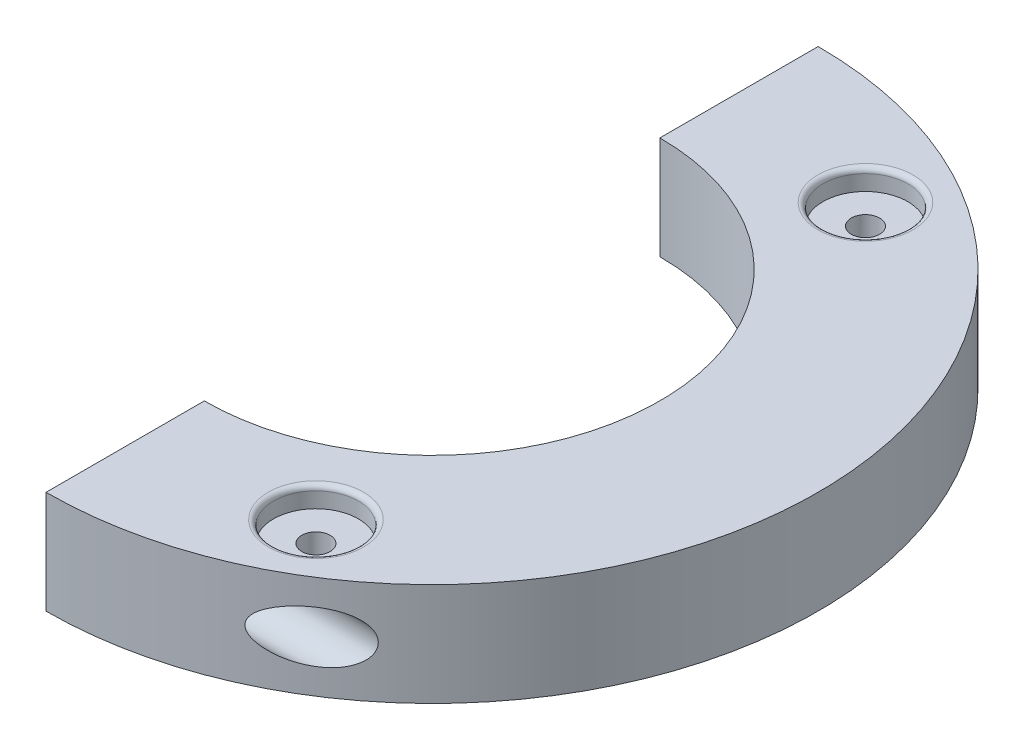
ISO-10303-21;
HEADER;
FILE_DESCRIPTION(('STEP AP214'),'2;1');
FILE_NAME('part.step','',(''),(''),'','','');
FILE_SCHEMA(('AUTOMOTIVE_DESIGN { 1 0 10303 214 1 1 1 1 }'));
ENDSEC;
DATA;
#1=APPLICATION_CONTEXT('core data for automotive mechanical design processes');
#2=APPLICATION_PROTOCOL_DEFINITION('international standard','automotive_design',2000,#1);
#3=PRODUCT_CONTEXT('',#1,'mechanical');
#4=PRODUCT('Part','Part','',(#3));
#5=PRODUCT_RELATED_PRODUCT_CATEGORY('part','',(#4));
#6=PRODUCT_DEFINITION_FORMATION('','',#4);
#7=PRODUCT_DEFINITION_CONTEXT('part definition',#1,'design');
#8=PRODUCT_DEFINITION('design','',#6,#7);
#9=PRODUCT_DEFINITION_SHAPE('','',#8);
#10=(LENGTH_UNIT() NAMED_UNIT(*) SI_UNIT(.MILLI.,.METRE.));
#11=(NAMED_UNIT(*) PLANE_ANGLE_UNIT() SI_UNIT($,.RADIAN.));
#12=(NAMED_UNIT(*) SI_UNIT($,.STERADIAN.) SOLID_ANGLE_UNIT());
#13=UNCERTAINTY_MEASURE_WITH_UNIT(LENGTH_MEASURE(1.E-05),#10,'distance_accuracy_value','');
#14=(GEOMETRIC_REPRESENTATION_CONTEXT(3) GLOBAL_UNCERTAINTY_ASSIGNED_CONTEXT((#13)) GLOBAL_UNIT_ASSIGNED_CONTEXT((#10,
#11,#12)) REPRESENTATION_CONTEXT('',''));
#15=CARTESIAN_POINT('',(0.,0.,0.));
#16=DIRECTION('',(0.,0.,1.));
#17=DIRECTION('',(1.,0.,0.));
#18=AXIS2_PLACEMENT_3D('',#15,#16,#17);
#19=CARTESIAN_POINT('',(30.8149999999999,-4.,-53.373145635235));
#20=DIRECTION('',(0.,1.,0.));
#21=DIRECTION('',(0.,0.,1.));
#22=AXIS2_PLACEMENT_3D('',#19,#20,#21);
#23=CYLINDRICAL_SURFACE('',#22,2.75);
#24=CARTESIAN_POINT('',(30.8149999999999,16.,-53.373145635235));
#25=DIRECTION('',(0.,1.,0.));
#26=DIRECTION('',(0.,0.,1.));
#27=AXIS2_PLACEMENT_3D('',#24,#25,#26);
#28=CIRCLE('',#27,2.75);
#29=CARTESIAN_POINT('',(30.8149999999999,16.,-50.623145635235));
#30=VERTEX_POINT('',#29);
#31=EDGE_CURVE('E153',#30,#30,#28,.T.);
#32=ORIENTED_EDGE('',*,*,#31,.T.);
#33=EDGE_LOOP('',(#32));
#34=FACE_BOUND('',#33,.T.);
#35=CARTESIAN_POINT('',(30.8149999999999,5.,-53.373145635235));
#36=DIRECTION('',(0.,-1.,0.));
#37=DIRECTION('',(0.,0.,-1.));
#38=AXIS2_PLACEMENT_3D('',#35,#36,#37);
#39=CIRCLE('',#38,2.75);
#40=CARTESIAN_POINT('',(30.8149999999999,5.,-56.123145635235));
#41=VERTEX_POINT('',#40);
#42=EDGE_CURVE('E116',#41,#41,#39,.F.);
#43=ORIENTED_EDGE('',*,*,#42,.F.);
#44=EDGE_LOOP('',(#43));
#45=FACE_BOUND('',#44,.T.);
#46=ADVANCED_FACE('F32',(#34,#45),#23,.F.);
#47=CARTESIAN_POINT('',(30.8149999999999,-4.,53.373145635235));
#48=DIRECTION('',(0.,1.,0.));
#49=DIRECTION('',(0.,0.,1.));
#50=AXIS2_PLACEMENT_3D('',#47,#48,#49);
#51=CYLINDRICAL_SURFACE('',#50,2.75);
#52=CARTESIAN_POINT('',(30.8149999999999,16.,53.373145635235));
#53=DIRECTION('',(0.,1.,0.));
#54=DIRECTION('',(0.,0.,1.));
#55=AXIS2_PLACEMENT_3D('',#52,#53,#54);
#56=CIRCLE('',#55,2.75);
#57=CARTESIAN_POINT('',(30.8149999999999,16.,56.123145635235));
#58=VERTEX_POINT('',#57);
#59=EDGE_CURVE('E114',#58,#58,#56,.T.);
#60=ORIENTED_EDGE('',*,*,#59,.T.);
#61=EDGE_LOOP('',(#60));
#62=FACE_BOUND('',#61,.T.);
#63=CARTESIAN_POINT('',(30.8149999999999,5.,53.373145635235));
#64=DIRECTION('',(0.,-1.,0.));
#65=DIRECTION('',(0.,0.,-1.));
#66=AXIS2_PLACEMENT_3D('',#63,#64,#65);
#67=CIRCLE('',#66,2.75);
#68=CARTESIAN_POINT('',(30.8149999999999,5.,50.623145635235));
#69=VERTEX_POINT('',#68);
#70=EDGE_CURVE('E111',#69,#69,#67,.F.);
#71=ORIENTED_EDGE('',*,*,#70,.F.);
#72=EDGE_LOOP('',(#71));
#73=FACE_BOUND('',#72,.T.);
#74=ADVANCED_FACE('F196',(#62,#73),#51,.F.);
#75=CARTESIAN_POINT('',(0.,20.,0.));
#76=DIRECTION('',(0.,-1.,0.));
#77=DIRECTION('',(0.,0.,-1.));
#78=AXIS2_PLACEMENT_3D('',#75,#76,#77);
#79=CYLINDRICAL_SURFACE('',#78,75.);
#80=CARTESIAN_POINT('',(31.6385840391127,10.,68.));
#81=CARTESIAN_POINT('',(31.6386043049395,10.130910240401,67.9999910185497));
#82=CARTESIAN_POINT('',(31.6497773414487,10.2619510558737,67.994795495824));
#83=CARTESIAN_POINT('',(31.6931025507327,10.519668822244,67.9746112354656));
#84=CARTESIAN_POINT('',(31.7252771460586,10.6463409565113,67.9596120307983));
#85=CARTESIAN_POINT('',(31.8178267223558,10.9242082664239,67.9163390108497));
#86=CARTESIAN_POINT('',(31.8833395122352,11.0732852500896,67.8856369495269));
#87=CARTESIAN_POINT('',(32.0347994083835,11.3580357433039,67.8142949470539));
#88=CARTESIAN_POINT('',(32.1207911429329,11.4936790507488,67.7736332960969));
#89=CARTESIAN_POINT('',(32.2920439725618,11.7310450800738,67.6921813405926));
#90=CARTESIAN_POINT('',(32.3751857787517,11.834710127069,67.6524696290556));
#91=CARTESIAN_POINT('',(32.5490861624433,12.0337483365845,67.5689743542185));
#92=CARTESIAN_POINT('',(32.6398502360732,12.1291154130981,67.5251878502367));
#93=CARTESIAN_POINT('',(32.8272551580185,12.3124975792838,67.4342805518963));
#94=CARTESIAN_POINT('',(32.923906236838,12.4004992007082,67.3871539283699));
#95=CARTESIAN_POINT('',(33.1216517788546,12.5698002260467,67.29017997161));
#96=CARTESIAN_POINT('',(33.2227479762706,12.6510969779066,67.2403315746364));
#97=CARTESIAN_POINT('',(33.4304405971,12.8092149661935,67.1373170810409));
#98=CARTESIAN_POINT('',(33.5371066321114,12.8859139312831,67.0841045283348));
#99=CARTESIAN_POINT('',(33.7532795122364,13.0336459938454,66.975598337797));
#100=CARTESIAN_POINT('',(33.862786943052,13.1046779106642,66.9203042698227));
#101=CARTESIAN_POINT('',(34.1948334160541,13.3101455609536,66.7515911470798));
#102=CARTESIAN_POINT('',(34.4207684896768,13.4368580978289,66.635404610631));
#103=CARTESIAN_POINT('',(34.8789150839471,13.6729110584102,66.3967488614365));
#104=CARTESIAN_POINT('',(35.1111390256008,13.782213644162,66.2742667095864));
#105=CARTESIAN_POINT('',(35.579585876079,13.9851739935609,66.0239623522249));
#106=CARTESIAN_POINT('',(35.8158099405935,14.0788271479136,65.8961385872342));
#107=CARTESIAN_POINT('',(36.2571270235109,14.2394761828398,65.6542062347242));
#108=CARTESIAN_POINT('',(36.4618804055682,14.3083689684906,65.5407256601142));
#109=CARTESIAN_POINT('',(36.8726841873701,14.4360961201177,65.3104938067467));
#110=CARTESIAN_POINT('',(37.0787346194584,14.4949302342274,65.1937424461748));
#111=CARTESIAN_POINT('',(37.4917638733236,14.6029013755365,64.9570960242608));
#112=CARTESIAN_POINT('',(37.6987432323428,14.6520317631716,64.8371988735894));
#113=CARTESIAN_POINT('',(38.1130589321957,14.740693310428,64.5945230981419));
#114=CARTESIAN_POINT('',(38.3203952852192,14.7802241354458,64.4717443730888));
#115=CARTESIAN_POINT('',(38.9420979478633,14.8844205027191,64.0995009801456));
#116=CARTESIAN_POINT('',(39.3565019543609,14.9347793411688,63.8459321188772));
#117=CARTESIAN_POINT('',(40.1821580307052,14.9958932141049,63.3295433783368));
#118=CARTESIAN_POINT('',(40.5934119289466,15.0066732865724,63.0667294538867));
#119=CARTESIAN_POINT('',(41.2716424289488,14.9889515230388,62.6239224243071));
#120=CARTESIAN_POINT('',(41.5403243878327,14.9725138182165,62.4460154508291));
#121=CARTESIAN_POINT('',(42.0740577199832,14.9193959061121,62.0876551154816));
#122=CARTESIAN_POINT('',(42.3391088582697,14.8827143949717,61.9072015903239));
#123=CARTESIAN_POINT('',(42.8637106567067,14.7873121871805,61.5451355567626));
#124=CARTESIAN_POINT('',(43.1232706443285,14.7286326769032,61.363525833862));
#125=CARTESIAN_POINT('',(43.6355876054964,14.5868425244106,61.0002781088228));
#126=CARTESIAN_POINT('',(43.8883476252455,14.5037430275374,60.8186401572835));
#127=CARTESIAN_POINT('',(44.292700512748,14.3459933279501,60.5243265465805));
#128=CARTESIAN_POINT('',(44.4470862874661,14.2796154886884,60.4110285808003));
#129=CARTESIAN_POINT('',(44.7513799759435,14.1351017303911,60.1859598404483));
#130=CARTESIAN_POINT('',(44.9012890405963,14.0569688651297,60.0741886774387));
#131=CARTESIAN_POINT('',(45.1955515749204,13.8879928905577,59.8531197687008));
#132=CARTESIAN_POINT('',(45.3399084478573,13.7971577308035,59.7438205252787));
#133=CARTESIAN_POINT('',(45.6217689404706,13.6017087347423,59.5288638860448));
#134=CARTESIAN_POINT('',(45.7592748954545,13.4970996385383,59.4232052530801));
#135=CARTESIAN_POINT('',(46.0805742278849,13.226880548985,59.1746310122888));
#136=CARTESIAN_POINT('',(46.2602107526337,13.0538524169725,59.0342160796604));
#137=CARTESIAN_POINT('',(46.5957992649364,12.6753816048502,58.7696947378267));
#138=CARTESIAN_POINT('',(46.7517902127327,12.4699934081908,58.64556154808));
#139=CARTESIAN_POINT('',(46.9961554696421,12.0809831685341,58.4498037077826));
#140=CARTESIAN_POINT('',(47.091695186325,11.904671951153,58.372800388076));
#141=CARTESIAN_POINT('',(47.2173190967098,11.6271976426384,58.2711565981192));
#142=CARTESIAN_POINT('',(47.2562542613524,11.5325109146366,58.2395788670354));
#143=CARTESIAN_POINT('',(47.3275890641949,11.3391879063436,58.1816244499434));
#144=CARTESIAN_POINT('',(47.3599917801059,11.2405535123404,58.1552453147905));
#145=CARTESIAN_POINT('',(47.4179528012435,11.0388162386357,58.1079957426459));
#146=CARTESIAN_POINT('',(47.4434357273605,10.9356773332701,58.0871860072642));
#147=CARTESIAN_POINT('',(47.4865271584831,10.7267413587895,58.0519639229023));
#148=CARTESIAN_POINT('',(47.5041398733758,10.6209457428534,58.0375481537299));
#149=CARTESIAN_POINT('',(47.5310720971355,10.4076554442149,58.015493537204));
#150=CARTESIAN_POINT('',(47.5403959386228,10.3001616790825,58.0078511493891));
#151=CARTESIAN_POINT('',(47.550522692893,10.0845127901001,57.9995503120097));
#152=CARTESIAN_POINT('',(47.5513268653733,9.97635776638832,57.99889082997));
#153=CARTESIAN_POINT('',(47.544910365453,9.77650245655008,58.0041507947662));
#154=CARTESIAN_POINT('',(47.5388601367066,9.68473665886655,58.009110692906));
#155=CARTESIAN_POINT('',(47.5206889250464,9.50220605199002,58.0239972210651));
#156=CARTESIAN_POINT('',(47.5085661052358,9.41144155417558,58.0339253539241));
#157=CARTESIAN_POINT('',(47.4633866845711,9.14167246190047,58.0708920680147));
#158=CARTESIAN_POINT('',(47.421513122503,8.96502242631506,58.1051179396722));
#159=CARTESIAN_POINT('',(47.3166866286472,8.62143224884714,58.190511844715));
#160=CARTESIAN_POINT('',(47.253609742257,8.45455614316863,58.2417794841566));
#161=CARTESIAN_POINT('',(47.1098030764085,8.13386104566194,58.35816185913));
#162=CARTESIAN_POINT('',(47.0290661728798,7.9800473580908,58.4232821825575));
#163=CARTESIAN_POINT('',(46.8015788538567,7.60041194360194,58.6058344367101));
#164=CARTESIAN_POINT('',(46.6438409479835,7.38510526546128,58.7315826642195));
#165=CARTESIAN_POINT('',(46.3880807885799,7.08829177846749,58.9335049569239));
#166=CARTESIAN_POINT('',(46.2994614586482,6.99356751427233,59.0031640411287));
#167=CARTESIAN_POINT('',(46.1167611813796,6.81244402617429,59.1460712207552));
#168=CARTESIAN_POINT('',(46.0226813052409,6.72604317824874,59.2193186118202));
#169=CARTESIAN_POINT('',(45.7776325808656,6.51645994795507,59.4091211183468));
#170=CARTESIAN_POINT('',(45.6234875454716,6.39874909997588,59.5276152823467));
#171=CARTESIAN_POINT('',(45.3066875712722,6.18061722855543,59.7690873263483));
#172=CARTESIAN_POINT('',(45.1440280189902,6.08020570764383,59.8920676259317));
#173=CARTESIAN_POINT('',(44.8119315085458,5.89513712783683,60.1409501045938));
#174=CARTESIAN_POINT('',(44.6424892863363,5.81049260548682,60.2668545199792));
#175=CARTESIAN_POINT('',(44.2982820710605,5.65567182056717,60.5203103213169));
#176=CARTESIAN_POINT('',(44.1235153073353,5.58550043261824,60.6478622468383));
#177=CARTESIAN_POINT('',(43.658996029399,5.41865419162277,60.9837503928164));
#178=CARTESIAN_POINT('',(43.3657347651916,5.33287804153372,61.1926841180324));
#179=CARTESIAN_POINT('',(42.7712516511226,5.19214981547569,61.6096756777762));
#180=CARTESIAN_POINT('',(42.4700249866923,5.13721684975711,61.8177328901721));
#181=CARTESIAN_POINT('',(41.8610235980899,5.05485349921706,62.2317501643527));
#182=CARTESIAN_POINT('',(41.5532306238292,5.02751399412685,62.4377010991448));
#183=CARTESIAN_POINT('',(40.9338567171218,4.99820913891234,62.8454997779355));
#184=CARTESIAN_POINT('',(40.6222764131166,4.99623963508988,63.0473481882158));
#185=CARTESIAN_POINT('',(40.1020295501006,5.01262304217613,63.378922596636));
#186=CARTESIAN_POINT('',(39.8940199065808,5.0243593242616,63.5100581865908));
#187=CARTESIAN_POINT('',(39.4773087583801,5.0578958468384,63.7699174025026));
#188=CARTESIAN_POINT('',(39.2686072782734,5.07969573359266,63.898641113072));
#189=CARTESIAN_POINT('',(38.8507295742256,5.13314826838208,64.1535717134416));
#190=CARTESIAN_POINT('',(38.6415531190296,5.16480786761748,64.2797767605526));
#191=CARTESIAN_POINT('',(38.2232614459783,5.23786920344642,64.5293854985368));
#192=CARTESIAN_POINT('',(38.0141462238856,5.2792698467558,64.6527895020815));
#193=CARTESIAN_POINT('',(37.5973267540532,5.37163142240865,64.8960628872289));
#194=CARTESIAN_POINT('',(37.389620480758,5.42254674814941,65.0159460978921));
#195=CARTESIAN_POINT('',(36.9751026330399,5.53423946437905,65.252576409314));
#196=CARTESIAN_POINT('',(36.7682909547953,5.59501567712685,65.3693238826531));
#197=CARTESIAN_POINT('',(36.3562431765671,5.72673913326962,65.5993842430308));
#198=CARTESIAN_POINT('',(36.1510058842703,5.797677666444,65.7126999717107));
#199=CARTESIAN_POINT('',(35.742621500715,5.95033119124091,65.9357194697817));
#200=CARTESIAN_POINT('',(35.5394739605264,6.03204381390883,66.0454240265726));
#201=CARTESIAN_POINT('',(35.209938016576,6.17508763821634,66.2214564946812));
#202=CARTESIAN_POINT('',(35.0826630679585,6.23293557652394,66.2889675144256));
#203=CARTESIAN_POINT('',(34.82960114638,6.3536204217156,66.4222803601497));
#204=CARTESIAN_POINT('',(34.7038140294241,6.41645684119103,66.4880823522814));
#205=CARTESIAN_POINT('',(34.453598010358,6.54775215057505,66.6180871525063));
#206=CARTESIAN_POINT('',(34.3291763053041,6.61623198339816,66.6822827348579));
#207=CARTESIAN_POINT('',(34.0826844067731,6.75907259688058,66.808605770358));
#208=CARTESIAN_POINT('',(33.9606140884361,6.83343306419852,66.8707333334476));
#209=CARTESIAN_POINT('',(33.6879822226047,7.00887225361027,67.0085729290475));
#210=CARTESIAN_POINT('',(33.5382923131001,7.11186157460865,67.0836024374376));
#211=CARTESIAN_POINT('',(33.2452875246971,7.32973979952337,67.2292914486518));
#212=CARTESIAN_POINT('',(33.1019778786707,7.44463822290437,67.2999473823061));
#213=CARTESIAN_POINT('',(32.8254511422169,7.68747902759857,67.4352525611696));
#214=CARTESIAN_POINT('',(32.6921773294313,7.81533671528237,67.4999361204446));
#215=CARTESIAN_POINT('',(32.4391852549822,8.08680499078399,67.6218815416477));
#216=CARTESIAN_POINT('',(32.319438199006,8.23038078477249,67.6791592075593));
#217=CARTESIAN_POINT('',(32.1261223096233,8.49941259021319,67.7710919083871));
#218=CARTESIAN_POINT('',(32.0483426713876,8.62106394364808,67.8078881254493));
#219=CARTESIAN_POINT('',(31.9088475730992,8.87534658408008,67.8736427328776));
#220=CARTESIAN_POINT('',(31.8471232060211,9.00797172905391,67.9026054694011));
#221=CARTESIAN_POINT('',(31.7459859072922,9.28112619033707,67.9499486893775));
#222=CARTESIAN_POINT('',(31.7062286062616,9.42149317938703,67.9684925879864));
#223=CARTESIAN_POINT('',(31.6659256886927,9.63626586211923,67.9872734469024));
#224=CARTESIAN_POINT('',(31.6557136747872,9.70854438952604,67.9920278496974));
#225=CARTESIAN_POINT('',(31.6420376160864,9.85386844322271,67.9983934362483));
#226=CARTESIAN_POINT('',(31.6385727248656,9.92691387214883,68.0000050142711));
#227=CARTESIAN_POINT('',(31.6385840391127,10.,68.));
#228=B_SPLINE_CURVE_WITH_KNOTS('',3,(#80,#81,#82,#83,#84,#85,#86,#87,#88,#89,#90,#91,#92,#93,
#94,#95,#96,#97,#98,#99,#100,#101,#102,#103,#104,#105,#106,#107,#108,#109,#110,#111,#112,#113,
#114,#115,#116,#117,#118,#119,#120,#121,#122,#123,#124,#125,#126,#127,#128,#129,#130,#131,#132,
#133,#134,#135,#136,#137,#138,#139,#140,#141,#142,#143,#144,#145,#146,#147,#148,#149,#150,#151,
#152,#153,#154,#155,#156,#157,#158,#159,#160,#161,#162,#163,#164,#165,#166,#167,#168,#169,#170,
#171,#172,#173,#174,#175,#176,#177,#178,#179,#180,#181,#182,#183,#184,#185,#186,#187,#188,#189,
#190,#191,#192,#193,#194,#195,#196,#197,#198,#199,#200,#201,#202,#203,#204,#205,#206,#207,#208,
#209,#210,#211,#212,#213,#214,#215,#216,#217,#218,#219,#220,#221,#222,#223,#224,#225,#226,#227),
.UNSPECIFIED.,.T.,.F.,(4,2,2,2,2,2,2,2,2,2,2,2,2,2,2,2,2,2,2,2,2,2,2,2,2,2,2,2,2,2,2,2,2,2,2,2,
2,2,2,2,2,2,2,2,2,2,2,2,2,2,2,2,2,2,2,2,2,2,2,2,2,2,2,2,2,2,2,2,2,2,2,2,2,4),(0.,
0.392417073033789,0.785253801385829,1.27957052302446,1.77497449280437,2.19047283332852,
2.60627338960528,3.02281837077644,3.43952733039178,3.86458353273259,4.28972805987059,
5.14053053489032,5.99315759009596,6.84603533226347,7.57787509030568,8.30973317074543,
9.04209028750928,9.77447292772995,11.2380225319928,12.7006461183171,13.6680614027211,
14.6355390034568,15.601214190905,16.5664493245216,17.1741422800083,17.78167763798,
18.3888344659034,18.9957828929539,19.8517621890389,20.7063154089797,21.3481238930543,
21.6692019117711,21.9901283017857,22.3144218768566,22.6385417744417,22.9624921537487,
23.2863946338805,23.5623436901235,23.8383762685974,24.3899379857357,24.9447818912269,
25.4998500355104,26.3796374792132,26.8210949376384,27.2624660859275,27.9432594415913,
28.624425573287,29.3061310184947,29.9880656917626,31.0967957446329,32.2062120039923,
33.3192703449708,34.4321464483875,35.1704725131323,35.9087726275919,36.6475944341911,
37.3863333587904,38.1216181282806,38.8568151431437,39.5913857426179,40.3257950967675,
40.7914671182698,41.2570936963057,41.7245335891587,42.1919485918911,42.7812566267783,
43.37103940821,43.9571898227963,44.5420680046284,44.9879263269214,45.433536769099,
45.8719475583687,46.0910583238718,46.3101416001906),.UNSPECIFIED.);
#229=CARTESIAN_POINT('',(31.6385840391127,10.,68.));
#230=VERTEX_POINT('',#229);
#231=EDGE_CURVE('E150',#230,#230,#228,.T.);
#232=ORIENTED_EDGE('',*,*,#231,.T.);
#233=EDGE_LOOP('',(#232));
#234=FACE_BOUND('',#233,.T.);
#235=CARTESIAN_POINT('',(47.5499737118749,10.,-58.));
#236=CARTESIAN_POINT('',(47.5499723727416,10.1037608748383,-58.0000011799093));
#237=CARTESIAN_POINT('',(47.5460233464358,10.2075660669426,-58.0032393125726));
#238=CARTESIAN_POINT('',(47.5303158600883,10.4142364656808,-58.01611132814));
#239=CARTESIAN_POINT('',(47.5185512475015,10.5171008669845,-58.0257502498375));
#240=CARTESIAN_POINT('',(47.4874437015999,10.7211645320364,-58.0512109600654));
#241=CARTESIAN_POINT('',(47.4680823081401,10.8223591091708,-58.0670478092908));
#242=CARTESIAN_POINT('',(47.4222135652454,11.0220380049845,-58.1045138960904));
#243=CARTESIAN_POINT('',(47.3957024609909,11.120520869515,-58.1261461772168));
#244=CARTESIAN_POINT('',(47.3067764586632,11.4090117897044,-58.1985799532132));
#245=CARTESIAN_POINT('',(47.2346303889152,11.5941740672888,-58.2571971699242));
#246=CARTESIAN_POINT('',(47.0690377978075,11.9477304624791,-58.3910697125667));
#247=CARTESIAN_POINT('',(46.9755924881431,12.1161255331742,-58.466324092017));
#248=CARTESIAN_POINT('',(46.7233475010711,12.5111510546761,-58.6682660529811));
#249=CARTESIAN_POINT('',(46.554549717121,12.7276165569583,-58.8024380220703));
#250=CARTESIAN_POINT('',(46.282181869623,13.0246467290276,-59.0167202373229));
#251=CARTESIAN_POINT('',(46.1880275579233,13.1191773190145,-59.0904497075076));
#252=CARTESIAN_POINT('',(45.9942710016582,13.2994898456921,-59.2413880720748));
#253=CARTESIAN_POINT('',(45.8946697841603,13.3852734230393,-59.3185963100213));
#254=CARTESIAN_POINT('',(45.634054505643,13.5940844190029,-59.519519401562));
#255=CARTESIAN_POINT('',(45.4697768564993,13.7111927500521,-59.6451510245068));
#256=CARTESIAN_POINT('',(45.1326667627059,13.9270821636187,-59.9006444277401));
#257=CARTESIAN_POINT('',(44.9598296063696,14.0258530067453,-60.0305085240925));
#258=CARTESIAN_POINT('',(44.6072906900314,14.2068076757718,-60.2929345860248));
#259=CARTESIAN_POINT('',(44.4275802514812,14.288969649091,-60.4254998565269));
#260=CARTESIAN_POINT('',(44.062947161912,14.4380170515863,-60.6919082980819));
#261=CARTESIAN_POINT('',(43.8780249007008,14.5049036198668,-60.8257513730716));
#262=CARTESIAN_POINT('',(43.3875464734487,14.6620300960876,-61.1772829354778));
#263=CARTESIAN_POINT('',(43.0785530536856,14.7408891398549,-61.3953010554046));
#264=CARTESIAN_POINT('',(42.4528433705354,14.8663433231199,-61.8296161734582));
#265=CARTESIAN_POINT('',(42.1361223760904,14.9129181566628,-62.0459120039287));
#266=CARTESIAN_POINT('',(41.4966620593214,14.9771518487592,-62.4754009046238));
#267=CARTESIAN_POINT('',(41.1739103515749,14.9947425525875,-62.6885854966473));
#268=CARTESIAN_POINT('',(40.5250133203557,15.0032289925226,-63.11000698686));
#269=CARTESIAN_POINT('',(40.1988687649609,14.9941306449048,-63.3182449712684));
#270=CARTESIAN_POINT('',(39.5254381890096,14.9496253604353,-63.7409356903702));
#271=CARTESIAN_POINT('',(39.1780327849019,14.9127086652467,-63.9550380195791));
#272=CARTESIAN_POINT('',(38.4825875310263,14.8118353875116,-64.375893762904));
#273=CARTESIAN_POINT('',(38.1345475415947,14.747871884382,-64.5826452814479));
#274=CARTESIAN_POINT('',(37.4411619731373,14.5932793059835,-64.9870739217281));
#275=CARTESIAN_POINT('',(37.0958112332019,14.5027651055138,-65.1847859802417));
#276=CARTESIAN_POINT('',(36.4086234098686,14.2939206651559,-65.5710861171299));
#277=CARTESIAN_POINT('',(36.0667844805571,14.1756059107681,-65.7596792047026));
#278=CARTESIAN_POINT('',(35.4584683331904,13.9356194415366,-66.0892660574068));
#279=CARTESIAN_POINT('',(35.1908184530616,13.8195363035611,-66.2321329612748));
#280=CARTESIAN_POINT('',(34.7936396817447,13.6287021068274,-66.4411409700276));
#281=CARTESIAN_POINT('',(34.6616439171905,13.5621215504521,-66.5100910237523));
#282=CARTESIAN_POINT('',(34.3997644123846,13.4229755174741,-66.6459147722235));
#283=CARTESIAN_POINT('',(34.2698804789705,13.3504105919706,-66.7127886573849));
#284=CARTESIAN_POINT('',(33.9665136572548,13.1714494989401,-66.8678880552954));
#285=CARTESIAN_POINT('',(33.7941542752265,13.0622733992092,-66.9551407219254));
#286=CARTESIAN_POINT('',(33.4562030754627,12.8298427586132,-67.1246468532476));
#287=CARTESIAN_POINT('',(33.2906183912359,12.706573871563,-67.2068950906933));
#288=CARTESIAN_POINT('',(32.9708656125867,12.4445454389353,-67.3643341515776));
#289=CARTESIAN_POINT('',(32.8166197149281,12.3059119176713,-67.4395742531998));
#290=CARTESIAN_POINT('',(32.5235991855315,12.0094719141358,-67.5813715107662));
#291=CARTESIAN_POINT('',(32.3847839826824,11.8517181049149,-67.6479515187097));
#292=CARTESIAN_POINT('',(32.1750043286016,11.5720111974751,-67.7478977010577));
#293=CARTESIAN_POINT('',(32.0971692876484,11.4565238188721,-67.7847909267088));
#294=CARTESIAN_POINT('',(31.9554883821782,11.2151960533089,-67.8516976945894));
#295=CARTESIAN_POINT('',(31.8916435592175,11.0893548964799,-67.8817107246036));
#296=CARTESIAN_POINT('',(31.7820433225614,10.8262597658295,-67.9330955388135));
#297=CARTESIAN_POINT('',(31.7365172552275,10.688885645803,-67.9543578368153));
#298=CARTESIAN_POINT('',(31.6699652639198,10.4071065863445,-67.9854007854103));
#299=CARTESIAN_POINT('',(31.6488925033436,10.2627156413641,-67.9952033855864));
#300=CARTESIAN_POINT('',(31.6349206722999,9.9863280591066,-68.0017046431936));
#301=CARTESIAN_POINT('',(31.6394897319517,9.85448599675647,-67.9995808925595));
#302=CARTESIAN_POINT('',(31.6703879030291,9.59393293688061,-67.9851954385008));
#303=CARTESIAN_POINT('',(31.6967346283386,9.465224560672,-67.9729255288094));
#304=CARTESIAN_POINT('',(31.7747084560193,9.19182164102291,-67.9365147299216));
#305=CARTESIAN_POINT('',(31.8300438699538,9.04844188629853,-67.9106291932069));
#306=CARTESIAN_POINT('',(31.9606659350658,8.77332042123505,-67.8492520029106));
#307=CARTESIAN_POINT('',(32.0359916866953,8.64160220125269,-67.8137415203119));
#308=CARTESIAN_POINT('',(32.185529432116,8.41362685161034,-67.742875823893));
#309=CARTESIAN_POINT('',(32.2573089638723,8.31534795957988,-67.7087365756703));
#310=CARTESIAN_POINT('',(32.4081970778022,8.12602278000345,-67.6366450536326));
#311=CARTESIAN_POINT('',(32.4873105534921,8.03498139797248,-67.59869023246));
#312=CARTESIAN_POINT('',(32.6512866093211,7.85940608311939,-67.5196399810683));
#313=CARTESIAN_POINT('',(32.7361594746035,7.77488440044155,-67.4785389145732));
#314=CARTESIAN_POINT('',(32.9103186550683,7.61186061607173,-67.3937707312348));
#315=CARTESIAN_POINT('',(32.9996067085245,7.53336091678991,-67.3501026024325));
#316=CARTESIAN_POINT('',(33.273006193034,7.3057097268692,-67.2156842465877));
#317=CARTESIAN_POINT('',(33.4623369936708,7.16473169644005,-67.1216719183058));
#318=CARTESIAN_POINT('',(33.8499663594477,6.90075589989915,-66.9270275070829));
#319=CARTESIAN_POINT('',(34.0482734867151,6.77777579546154,-66.8263890603449));
#320=CARTESIAN_POINT('',(34.4512936013241,6.54700789075351,-66.6195149942914));
#321=CARTESIAN_POINT('',(34.6560185776136,6.43925088447226,-66.5132686105256));
#322=CARTESIAN_POINT('',(35.0696855103113,6.23732013658188,-66.2960917127658));
#323=CARTESIAN_POINT('',(35.2786287851861,6.14315071923315,-66.1851597220302));
#324=CARTESIAN_POINT('',(35.68326947346,5.97389317586075,-65.9678172721306));
#325=CARTESIAN_POINT('',(35.8787532644432,5.89789540712,-65.8617128711058));
#326=CARTESIAN_POINT('',(36.2715036470946,5.75569775294288,-65.6462352826183));
#327=CARTESIAN_POINT('',(36.4687704916417,5.6894992811676,-65.5368616262581));
#328=CARTESIAN_POINT('',(36.8646299824426,5.5663976058662,-65.3150102553543));
#329=CARTESIAN_POINT('',(37.0632233980375,5.50950039266402,-65.2025305945141));
#330=CARTESIAN_POINT('',(37.4611671360206,5.40476237761777,-64.9747147885982));
#331=CARTESIAN_POINT('',(37.6605175342605,5.35692250915196,-64.8593783505092));
#332=CARTESIAN_POINT('',(38.2592733690853,5.22670684206623,-64.5092369947183));
#333=CARTESIAN_POINT('',(38.6592796643651,5.1576669223251,-64.270358134652));
#334=CARTESIAN_POINT('',(39.4578546755128,5.05545891354299,-63.7831983272743));
#335=CARTESIAN_POINT('',(39.8564240280408,5.0222722850195,-63.5349223079797));
#336=CARTESIAN_POINT('',(40.5606742408843,4.99692092494453,-63.0869612668485));
#337=CARTESIAN_POINT('',(40.8671146341886,4.99721759035584,-62.8888850781845));
#338=CARTESIAN_POINT('',(41.476475696372,5.02217264218484,-62.4886772344276));
#339=CARTESIAN_POINT('',(41.7793958065468,5.04683484364401,-62.2865449491057));
#340=CARTESIAN_POINT('',(42.3791995803365,5.12267982028696,-61.8799997537683));
#341=CARTESIAN_POINT('',(42.6760972943526,5.17379105053844,-61.6755944445849));
#342=CARTESIAN_POINT('',(43.2624679969429,5.30547641010101,-61.2657045397667));
#343=CARTESIAN_POINT('',(43.5519454006999,5.38603256233952,-61.0602206779117));
#344=CARTESIAN_POINT('',(43.9966722463112,5.53814370596804,-60.7398721853829));
#345=CARTESIAN_POINT('',(44.1554850057151,5.59834527794827,-60.6245079581997));
#346=CARTESIAN_POINT('',(44.4690577275035,5.73024029842184,-60.3948724126904));
#347=CARTESIAN_POINT('',(44.6238186998847,5.80193085068597,-60.280600826596));
#348=CARTESIAN_POINT('',(44.9283694130065,5.95775632653926,-60.0539561559794));
#349=CARTESIAN_POINT('',(45.0781600723138,6.04188893484338,-59.9415827225645));
#350=CARTESIAN_POINT('',(45.3715979878466,6.22366518944911,-59.7197780706018));
#351=CARTESIAN_POINT('',(45.5152468005044,6.32130538584849,-59.6103461092844));
#352=CARTESIAN_POINT('',(45.7602644101636,6.50526590865095,-59.4223508929378));
#353=CARTESIAN_POINT('',(45.8632964305001,6.58840465718039,-59.3428523930753));
#354=CARTESIAN_POINT('',(46.0641813892817,6.76345962067345,-59.1870544731717));
#355=CARTESIAN_POINT('',(46.1620332642137,6.85537762728959,-59.1107557107178));
#356=CARTESIAN_POINT('',(46.4460634135916,7.14478653298863,-58.8882032758006));
#357=CARTESIAN_POINT('',(46.6232694533152,7.35633500128654,-58.74786768241));
#358=CARTESIAN_POINT('',(46.8967195987223,7.75246066687498,-58.5296442211667));
#359=CARTESIAN_POINT('',(47.0016400574751,7.92752189035363,-58.4453612181043));
#360=CARTESIAN_POINT('',(47.1882778776302,8.29690936394152,-58.2947748081923));
#361=CARTESIAN_POINT('',(47.2700136140331,8.49122019208014,-58.2284571648218));
#362=CARTESIAN_POINT('',(47.3944310503839,8.86529235223828,-58.1272176137037));
#363=CARTESIAN_POINT('',(47.4411525679128,9.04280069727372,-58.0890620633812));
#364=CARTESIAN_POINT('',(47.4933585629146,9.31443045451864,-58.0463725329405));
#365=CARTESIAN_POINT('',(47.5077768182953,9.40579376588554,-58.0345702616538));
#366=CARTESIAN_POINT('',(47.5304504421613,9.58977063496391,-58.0160021590858));
#367=CARTESIAN_POINT('',(47.5387095421342,9.6823834010151,-58.0092332783619));
#368=CARTESIAN_POINT('',(47.5458621296711,9.81265091706554,-58.0033705794351));
#369=CARTESIAN_POINT('',(47.5474031044837,9.85008906973982,-58.0021073750246));
#370=CARTESIAN_POINT('',(47.5494591932681,9.92501621591542,-58.0004218264431));
#371=CARTESIAN_POINT('',(47.549974195781,9.96250521449785,-57.9999995736307));
#372=CARTESIAN_POINT('',(47.5499737118749,10.,-58.));
#373=B_SPLINE_CURVE_WITH_KNOTS('',3,(#235,#236,#237,#238,#239,#240,#241,#242,#243,#244,#245,
#246,#247,#248,#249,#250,#251,#252,#253,#254,#255,#256,#257,#258,#259,#260,#261,#262,#263,#264,
#265,#266,#267,#268,#269,#270,#271,#272,#273,#274,#275,#276,#277,#278,#279,#280,#281,#282,#283,
#284,#285,#286,#287,#288,#289,#290,#291,#292,#293,#294,#295,#296,#297,#298,#299,#300,#301,#302,
#303,#304,#305,#306,#307,#308,#309,#310,#311,#312,#313,#314,#315,#316,#317,#318,#319,#320,#321,
#322,#323,#324,#325,#326,#327,#328,#329,#330,#331,#332,#333,#334,#335,#336,#337,#338,#339,#340,
#341,#342,#343,#344,#345,#346,#347,#348,#349,#350,#351,#352,#353,#354,#355,#356,#357,#358,#359,
#360,#361,#362,#363,#364,#365,#366,#367,#368,#369,#370,#371,#372),.UNSPECIFIED.,.T.,.F.,(4,2,2,
2,2,2,2,2,2,2,2,2,2,2,2,2,2,2,2,2,2,2,2,2,2,2,2,2,2,2,2,2,2,2,2,2,2,2,2,2,2,2,2,2,2,2,2,2,2,2,2,
2,2,2,2,2,2,2,2,2,2,2,2,2,2,2,2,2,4),(0.,0.311234822679143,0.622714944801081,0.934956697111046,
1.24736275007898,1.86579594157621,2.48419395972641,3.39531085512708,3.85236736446933,
4.3093379864931,5.02122970817912,5.73351775224517,6.44673695229987,7.15990294940099,
8.31700710124396,9.47483838367091,10.6353883828675,11.7956811374653,13.023935715787,
14.2525047632519,15.4758347482734,16.6984849211023,17.6721892145484,18.1614505536627,
18.6506668870135,19.3158654837818,19.9817473728573,20.6425235113015,21.3015190231827,
21.7327978001286,22.1641086744074,22.6006629426702,23.0363796700359,23.4298807946176,
23.8237004966373,24.2886942555844,24.7546043177048,25.1332744519727,25.5121990949187,
25.891819198515,26.2715899685788,27.0325584660493,27.7942687785476,28.5574985029399,
29.3209705925368,30.0258685562357,30.7308681106637,31.4363199348726,32.1418444178393,
33.5532617881998,34.9639489748138,36.0578395860897,37.1519015007804,38.2430193163039,
39.3334720789529,39.9491195870715,40.5646121415231,41.1799903055761,41.7952115882957,
42.2581294821663,42.7211420500273,43.6447702971721,44.3049696053925,44.9646442027408,
45.5244173240532,45.8038615791604,46.083136396784,46.1955912636168,46.3080583465644),.UNSPECIFIED.);
#374=CARTESIAN_POINT('',(47.5499737118749,10.,-58.));
#375=VERTEX_POINT('',#374);
#376=EDGE_CURVE('E103',#375,#375,#373,.T.);
#377=ORIENTED_EDGE('',*,*,#376,.T.);
#378=EDGE_LOOP('',(#377));
#379=FACE_BOUND('',#378,.T.);
#380=CARTESIAN_POINT('',(0.,0.,0.));
#381=DIRECTION('',(0.,1.,0.));
#382=DIRECTION('',(0.,0.,1.));
#383=AXIS2_PLACEMENT_3D('',#380,#381,#382);
#384=CIRCLE('',#383,75.);
#385=CARTESIAN_POINT('',(0.,0.,75.));
#386=VERTEX_POINT('',#385);
#387=CARTESIAN_POINT('',(0.,0.,-75.));
#388=VERTEX_POINT('',#387);
#389=EDGE_CURVE('E100',#386,#388,#384,.T.);
#390=ORIENTED_EDGE('',*,*,#389,.T.);
#391=DIRECTION('',(0.,-1.,0.));
#392=VECTOR('',#391,1.);
#393=CARTESIAN_POINT('',(0.,20.,-75.));
#394=LINE('',#393,#392);
#395=CARTESIAN_POINT('',(0.,20.,-75.));
#396=VERTEX_POINT('',#395);
#397=EDGE_CURVE('E91',#396,#388,#394,.T.);
#398=ORIENTED_EDGE('',*,*,#397,.F.);
#399=CARTESIAN_POINT('',(0.,20.,0.));
#400=DIRECTION('',(0.,1.,0.));
#401=DIRECTION('',(0.,0.,1.));
#402=AXIS2_PLACEMENT_3D('',#399,#400,#401);
#403=CIRCLE('',#402,75.);
#404=CARTESIAN_POINT('',(0.,20.,75.));
#405=VERTEX_POINT('',#404);
#406=EDGE_CURVE('E85',#405,#396,#403,.T.);
#407=ORIENTED_EDGE('',*,*,#406,.F.);
#408=DIRECTION('',(0.,-1.,0.));
#409=VECTOR('',#408,1.);
#410=CARTESIAN_POINT('',(0.,20.,75.));
#411=LINE('',#410,#409);
#412=EDGE_CURVE('E96',#405,#386,#411,.T.);
#413=ORIENTED_EDGE('',*,*,#412,.T.);
#414=EDGE_LOOP('',(#390,#398,#407,#413));
#415=FACE_BOUND('',#414,.T.);
#416=ADVANCED_FACE('F165',(#234,#379,#415),#79,.T.);
#417=CARTESIAN_POINT('',(0.,20.,-44.25));
#418=DIRECTION('',(1.,0.,0.));
#419=DIRECTION('',(0.,0.,-1.));
#420=AXIS2_PLACEMENT_3D('',#417,#418,#419);
#421=PLANE('',#420);
#422=CARTESIAN_POINT('',(0.,10.,-63.));
#423=DIRECTION('',(-1.,0.,0.));
#424=DIRECTION('',(0.,0.,1.));
#425=AXIS2_PLACEMENT_3D('',#422,#423,#424);
#426=CIRCLE('',#425,5.);
#427=CARTESIAN_POINT('',(0.,10.,-58.));
#428=VERTEX_POINT('',#427);
#429=EDGE_CURVE('E163',#428,#428,#426,.T.);
#430=ORIENTED_EDGE('',*,*,#429,.F.);
#431=EDGE_LOOP('',(#430));
#432=FACE_BOUND('',#431,.T.);
#433=DIRECTION('',(0.,0.,1.));
#434=VECTOR('',#433,1.);
#435=CARTESIAN_POINT('',(0.,0.,-44.25));
#436=LINE('',#435,#434);
#437=CARTESIAN_POINT('',(0.,0.,-44.25));
#438=VERTEX_POINT('',#437);
#439=EDGE_CURVE('E90',#388,#438,#436,.T.);
#440=ORIENTED_EDGE('',*,*,#439,.T.);
#441=DIRECTION('',(0.,-1.,0.));
#442=VECTOR('',#441,1.);
#443=CARTESIAN_POINT('',(0.,20.,-44.25));
#444=LINE('',#443,#442);
#445=CARTESIAN_POINT('',(0.,20.,-44.25));
#446=VERTEX_POINT('',#445);
#447=EDGE_CURVE('E88',#446,#438,#444,.T.);
#448=ORIENTED_EDGE('',*,*,#447,.F.);
#449=DIRECTION('',(0.,0.,1.));
#450=VECTOR('',#449,1.);
#451=CARTESIAN_POINT('',(0.,20.,-44.25));
#452=LINE('',#451,#450);
#453=EDGE_CURVE('E80',#396,#446,#452,.T.);
#454=ORIENTED_EDGE('',*,*,#453,.F.);
#455=ORIENTED_EDGE('',*,*,#397,.T.);
#456=EDGE_LOOP('',(#440,#448,#454,#455));
#457=FACE_BOUND('',#456,.T.);
#458=ADVANCED_FACE('F89',(#432,#457),#421,.F.);
#459=CARTESIAN_POINT('',(0.,20.,0.));
#460=DIRECTION('',(0.,-1.,0.));
#461=DIRECTION('',(0.,0.,-1.));
#462=AXIS2_PLACEMENT_3D('',#459,#460,#461);
#463=CYLINDRICAL_SURFACE('',#462,44.25);
#464=CARTESIAN_POINT('',(0.,0.,0.));
#465=DIRECTION('',(0.,-1.,0.));
#466=DIRECTION('',(0.,0.,-1.));
#467=AXIS2_PLACEMENT_3D('',#464,#465,#466);
#468=CIRCLE('',#467,44.25);
#469=CARTESIAN_POINT('',(0.,0.,44.25));
#470=VERTEX_POINT('',#469);
#471=EDGE_CURVE('E66',#438,#470,#468,.T.);
#472=ORIENTED_EDGE('',*,*,#471,.T.);
#473=DIRECTION('',(0.,-1.,0.));
#474=VECTOR('',#473,1.);
#475=CARTESIAN_POINT('',(0.,20.,44.25));
#476=LINE('',#475,#474);
#477=CARTESIAN_POINT('',(0.,20.,44.25));
#478=VERTEX_POINT('',#477);
#479=EDGE_CURVE('E92',#478,#470,#476,.T.);
#480=ORIENTED_EDGE('',*,*,#479,.F.);
#481=CARTESIAN_POINT('',(0.,20.,0.));
#482=DIRECTION('',(0.,-1.,0.));
#483=DIRECTION('',(0.,0.,-1.));
#484=AXIS2_PLACEMENT_3D('',#481,#482,#483);
#485=CIRCLE('',#484,44.25);
#486=EDGE_CURVE('E83',#446,#478,#485,.T.);
#487=ORIENTED_EDGE('',*,*,#486,.F.);
#488=ORIENTED_EDGE('',*,*,#447,.T.);
#489=EDGE_LOOP('',(#472,#480,#487,#488));
#490=FACE_BOUND('',#489,.T.);
#491=ADVANCED_FACE('F94',(#490),#463,.F.);
#492=CARTESIAN_POINT('',(0.,20.,44.25));
#493=DIRECTION('',(1.,0.,0.));
#494=DIRECTION('',(0.,0.,-1.));
#495=AXIS2_PLACEMENT_3D('',#492,#493,#494);
#496=PLANE('',#495);
#497=CARTESIAN_POINT('',(0.,10.,63.));
#498=DIRECTION('',(-1.,0.,0.));
#499=DIRECTION('',(0.,0.,1.));
#500=AXIS2_PLACEMENT_3D('',#497,#498,#499);
#501=CIRCLE('',#500,5.);
#502=CARTESIAN_POINT('',(0.,10.,68.));
#503=VERTEX_POINT('',#502);
#504=EDGE_CURVE('E146',#503,#503,#501,.T.);
#505=ORIENTED_EDGE('',*,*,#504,.F.);
#506=EDGE_LOOP('',(#505));
#507=FACE_BOUND('',#506,.T.);
#508=DIRECTION('',(0.,0.,1.));
#509=VECTOR('',#508,1.);
#510=CARTESIAN_POINT('',(0.,0.,44.25));
#511=LINE('',#510,#509);
#512=EDGE_CURVE('E72',#470,#386,#511,.T.);
#513=ORIENTED_EDGE('',*,*,#512,.T.);
#514=ORIENTED_EDGE('',*,*,#412,.F.);
#515=DIRECTION('',(0.,0.,1.));
#516=VECTOR('',#515,1.);
#517=CARTESIAN_POINT('',(0.,20.,44.25));
#518=LINE('',#517,#516);
#519=EDGE_CURVE('E49',#478,#405,#518,.T.);
#520=ORIENTED_EDGE('',*,*,#519,.F.);
#521=ORIENTED_EDGE('',*,*,#479,.T.);
#522=EDGE_LOOP('',(#513,#514,#520,#521));
#523=FACE_BOUND('',#522,.T.);
#524=ADVANCED_FACE('F194',(#507,#523),#496,.F.);
#525=CARTESIAN_POINT('',(0.,20.,0.));
#526=DIRECTION('',(0.,1.,0.));
#527=DIRECTION('',(0.,0.,1.));
#528=AXIS2_PLACEMENT_3D('',#525,#526,#527);
#529=PLANE('',#528);
#530=CARTESIAN_POINT('',(30.8149999999999,20.,53.373145635235));
#531=DIRECTION('',(0.,1.,0.));
#532=DIRECTION('',(0.,0.,1.));
#533=AXIS2_PLACEMENT_3D('',#530,#531,#532);
#534=CIRCLE('',#533,9.25);
#535=CARTESIAN_POINT('',(30.8149999999999,20.,62.623145635235));
#536=VERTEX_POINT('',#535);
#537=EDGE_CURVE('E41',#536,#536,#534,.F.);
#538=ORIENTED_EDGE('',*,*,#537,.T.);
#539=EDGE_LOOP('',(#538));
#540=FACE_BOUND('',#539,.T.);
#541=CARTESIAN_POINT('',(30.8149999999999,20.,-53.373145635235));
#542=DIRECTION('',(0.,1.,0.));
#543=DIRECTION('',(0.,0.,1.));
#544=AXIS2_PLACEMENT_3D('',#541,#542,#543);
#545=CIRCLE('',#544,9.25);
#546=CARTESIAN_POINT('',(30.8149999999999,20.,-44.123145635235));
#547=VERTEX_POINT('',#546);
#548=EDGE_CURVE('E123',#547,#547,#545,.F.);
#549=ORIENTED_EDGE('',*,*,#548,.T.);
#550=EDGE_LOOP('',(#549));
#551=FACE_BOUND('',#550,.T.);
#552=ORIENTED_EDGE('',*,*,#406,.T.);
#553=ORIENTED_EDGE('',*,*,#453,.T.);
#554=ORIENTED_EDGE('',*,*,#486,.T.);
#555=ORIENTED_EDGE('',*,*,#519,.T.);
#556=EDGE_LOOP('',(#552,#553,#554,#555));
#557=FACE_BOUND('',#556,.T.);
#558=ADVANCED_FACE('F81',(#540,#551,#557),#529,.T.);
#559=CARTESIAN_POINT('',(0.,0.,0.));
#560=DIRECTION('',(0.,1.,0.));
#561=DIRECTION('',(0.,0.,1.));
#562=AXIS2_PLACEMENT_3D('',#559,#560,#561);
#563=PLANE('',#562);
#564=CARTESIAN_POINT('',(30.8149999999999,0.,-53.373145635235));
#565=DIRECTION('',(0.,-1.,0.));
#566=DIRECTION('',(0.,0.,-1.));
#567=AXIS2_PLACEMENT_3D('',#564,#565,#566);
#568=CIRCLE('',#567,5.);
#569=CARTESIAN_POINT('',(30.8149999999999,0.,-58.373145635235));
#570=VERTEX_POINT('',#569);
#571=EDGE_CURVE('E232',#570,#570,#568,.T.);
#572=ORIENTED_EDGE('',*,*,#571,.F.);
#573=EDGE_LOOP('',(#572));
#574=FACE_BOUND('',#573,.T.);
#575=CARTESIAN_POINT('',(30.8149999999999,0.,53.373145635235));
#576=DIRECTION('',(0.,-1.,0.));
#577=DIRECTION('',(0.,0.,-1.));
#578=AXIS2_PLACEMENT_3D('',#575,#576,#577);
#579=CIRCLE('',#578,5.);
#580=CARTESIAN_POINT('',(30.8149999999999,0.,48.373145635235));
#581=VERTEX_POINT('',#580);
#582=EDGE_CURVE('E119',#581,#581,#579,.T.);
#583=ORIENTED_EDGE('',*,*,#582,.F.);
#584=EDGE_LOOP('',(#583));
#585=FACE_BOUND('',#584,.T.);
#586=ORIENTED_EDGE('',*,*,#389,.F.);
#587=ORIENTED_EDGE('',*,*,#512,.F.);
#588=ORIENTED_EDGE('',*,*,#471,.F.);
#589=ORIENTED_EDGE('',*,*,#439,.F.);
#590=EDGE_LOOP('',(#586,#587,#588,#589));
#591=FACE_BOUND('',#590,.T.);
#592=ADVANCED_FACE('F177',(#574,#585,#591),#563,.F.);
#593=CARTESIAN_POINT('',(150.,10.,-63.));
#594=DIRECTION('',(-1.,0.,0.));
#595=DIRECTION('',(0.,0.,1.));
#596=AXIS2_PLACEMENT_3D('',#593,#594,#595);
#597=CYLINDRICAL_SURFACE('',#596,5.);
#598=ORIENTED_EDGE('',*,*,#429,.T.);
#599=EDGE_LOOP('',(#598));
#600=FACE_BOUND('',#599,.T.);
#601=ORIENTED_EDGE('',*,*,#376,.F.);
#602=EDGE_LOOP('',(#601));
#603=FACE_BOUND('',#602,.T.);
#604=ADVANCED_FACE('F171',(#600,#603),#597,.F.);
#605=CARTESIAN_POINT('',(150.,10.,63.));
#606=DIRECTION('',(-1.,0.,0.));
#607=DIRECTION('',(0.,0.,1.));
#608=AXIS2_PLACEMENT_3D('',#605,#606,#607);
#609=CYLINDRICAL_SURFACE('',#608,5.);
#610=ORIENTED_EDGE('',*,*,#504,.T.);
#611=EDGE_LOOP('',(#610));
#612=FACE_BOUND('',#611,.T.);
#613=ORIENTED_EDGE('',*,*,#231,.F.);
#614=EDGE_LOOP('',(#613));
#615=FACE_BOUND('',#614,.T.);
#616=ADVANCED_FACE('F140',(#612,#615),#609,.F.);
#617=CARTESIAN_POINT('',(30.8149999999999,16.,53.373145635235));
#618=DIRECTION('',(0.,1.,0.));
#619=DIRECTION('',(0.,0.,1.));
#620=AXIS2_PLACEMENT_3D('',#617,#618,#619);
#621=CYLINDRICAL_SURFACE('',#620,8.25);
#622=CARTESIAN_POINT('',(30.8149999999999,19.,53.373145635235));
#623=DIRECTION('',(0.,1.,0.));
#624=DIRECTION('',(0.,0.,1.));
#625=AXIS2_PLACEMENT_3D('',#622,#623,#624);
#626=CIRCLE('',#625,8.25);
#627=CARTESIAN_POINT('',(30.8149999999999,19.,61.623145635235));
#628=VERTEX_POINT('',#627);
#629=EDGE_CURVE('E110',#628,#628,#626,.T.);
#630=ORIENTED_EDGE('',*,*,#629,.T.);
#631=EDGE_LOOP('',(#630));
#632=FACE_BOUND('',#631,.T.);
#633=CARTESIAN_POINT('',(30.8149999999999,16.,53.373145635235));
#634=DIRECTION('',(0.,1.,0.));
#635=DIRECTION('',(0.,0.,1.));
#636=AXIS2_PLACEMENT_3D('',#633,#634,#635);
#637=CIRCLE('',#636,8.25);
#638=CARTESIAN_POINT('',(30.8149999999999,16.,61.623145635235));
#639=VERTEX_POINT('',#638);
#640=EDGE_CURVE('E144',#639,#639,#637,.T.);
#641=ORIENTED_EDGE('',*,*,#640,.F.);
#642=EDGE_LOOP('',(#641));
#643=FACE_BOUND('',#642,.T.);
#644=ADVANCED_FACE('F136',(#632,#643),#621,.F.);
#645=CARTESIAN_POINT('',(30.8149999999999,16.,53.373145635235));
#646=DIRECTION('',(0.,1.,0.));
#647=DIRECTION('',(0.,0.,1.));
#648=AXIS2_PLACEMENT_3D('',#645,#646,#647);
#649=PLANE('',#648);
#650=ORIENTED_EDGE('',*,*,#59,.F.);
#651=EDGE_LOOP('',(#650));
#652=FACE_BOUND('',#651,.T.);
#653=ORIENTED_EDGE('',*,*,#640,.T.);
#654=EDGE_LOOP('',(#653));
#655=FACE_BOUND('',#654,.T.);
#656=ADVANCED_FACE('F139',(#652,#655),#649,.T.);
#657=CARTESIAN_POINT('',(30.8149999999999,16.,-53.373145635235));
#658=DIRECTION('',(0.,1.,0.));
#659=DIRECTION('',(0.,0.,1.));
#660=AXIS2_PLACEMENT_3D('',#657,#658,#659);
#661=CYLINDRICAL_SURFACE('',#660,8.25);
#662=CARTESIAN_POINT('',(30.8149999999999,19.,-53.373145635235));
#663=DIRECTION('',(0.,1.,0.));
#664=DIRECTION('',(0.,0.,1.));
#665=AXIS2_PLACEMENT_3D('',#662,#663,#664);
#666=CIRCLE('',#665,8.25);
#667=CARTESIAN_POINT('',(30.8149999999999,19.,-45.123145635235));
#668=VERTEX_POINT('',#667);
#669=EDGE_CURVE('E11',#668,#668,#666,.T.);
#670=ORIENTED_EDGE('',*,*,#669,.T.);
#671=EDGE_LOOP('',(#670));
#672=FACE_BOUND('',#671,.T.);
#673=CARTESIAN_POINT('',(30.8149999999999,16.,-53.373145635235));
#674=DIRECTION('',(0.,1.,0.));
#675=DIRECTION('',(0.,0.,1.));
#676=AXIS2_PLACEMENT_3D('',#673,#674,#675);
#677=CIRCLE('',#676,8.25);
#678=CARTESIAN_POINT('',(30.8149999999999,16.,-45.123145635235));
#679=VERTEX_POINT('',#678);
#680=EDGE_CURVE('E147',#679,#679,#677,.T.);
#681=ORIENTED_EDGE('',*,*,#680,.F.);
#682=EDGE_LOOP('',(#681));
#683=FACE_BOUND('',#682,.T.);
#684=ADVANCED_FACE('F214',(#672,#683),#661,.F.);
#685=CARTESIAN_POINT('',(30.8149999999999,16.,-53.373145635235));
#686=DIRECTION('',(0.,1.,0.));
#687=DIRECTION('',(0.,0.,1.));
#688=AXIS2_PLACEMENT_3D('',#685,#686,#687);
#689=PLANE('',#688);
#690=ORIENTED_EDGE('',*,*,#31,.F.);
#691=EDGE_LOOP('',(#690));
#692=FACE_BOUND('',#691,.T.);
#693=ORIENTED_EDGE('',*,*,#680,.T.);
#694=EDGE_LOOP('',(#693));
#695=FACE_BOUND('',#694,.T.);
#696=ADVANCED_FACE('F210',(#692,#695),#689,.T.);
#697=CARTESIAN_POINT('',(30.8149999999999,5.,53.373145635235));
#698=DIRECTION('',(0.,-1.,0.));
#699=DIRECTION('',(0.,0.,-1.));
#700=AXIS2_PLACEMENT_3D('',#697,#698,#699);
#701=PLANE('',#700);
#702=CARTESIAN_POINT('',(30.8149999999999,5.,53.373145635235));
#703=DIRECTION('',(0.,-1.,0.));
#704=DIRECTION('',(0.,0.,-1.));
#705=AXIS2_PLACEMENT_3D('',#702,#703,#704);
#706=CIRCLE('',#705,5.);
#707=CARTESIAN_POINT('',(30.8149999999999,5.,48.373145635235));
#708=VERTEX_POINT('',#707);
#709=EDGE_CURVE('E115',#708,#708,#706,.T.);
#710=ORIENTED_EDGE('',*,*,#709,.T.);
#711=EDGE_LOOP('',(#710));
#712=FACE_BOUND('',#711,.T.);
#713=ORIENTED_EDGE('',*,*,#70,.T.);
#714=EDGE_LOOP('',(#713));
#715=FACE_BOUND('',#714,.T.);
#716=ADVANCED_FACE('F213',(#712,#715),#701,.T.);
#717=CARTESIAN_POINT('',(30.8149999999999,5.,53.373145635235));
#718=DIRECTION('',(0.,-1.,0.));
#719=DIRECTION('',(0.,0.,-1.));
#720=AXIS2_PLACEMENT_3D('',#717,#718,#719);
#721=CYLINDRICAL_SURFACE('',#720,5.);
#722=ORIENTED_EDGE('',*,*,#709,.F.);
#723=EDGE_LOOP('',(#722));
#724=FACE_BOUND('',#723,.T.);
#725=ORIENTED_EDGE('',*,*,#582,.T.);
#726=EDGE_LOOP('',(#725));
#727=FACE_BOUND('',#726,.T.);
#728=ADVANCED_FACE('F299',(#724,#727),#721,.F.);
#729=CARTESIAN_POINT('',(30.8149999999999,5.,-53.373145635235));
#730=DIRECTION('',(0.,-1.,0.));
#731=DIRECTION('',(0.,0.,-1.));
#732=AXIS2_PLACEMENT_3D('',#729,#730,#731);
#733=PLANE('',#732);
#734=CARTESIAN_POINT('',(30.8149999999999,5.,-53.373145635235));
#735=DIRECTION('',(0.,-1.,0.));
#736=DIRECTION('',(0.,0.,-1.));
#737=AXIS2_PLACEMENT_3D('',#734,#735,#736);
#738=CIRCLE('',#737,5.);
#739=CARTESIAN_POINT('',(30.8149999999999,5.,-58.373145635235));
#740=VERTEX_POINT('',#739);
#741=EDGE_CURVE('E120',#740,#740,#738,.T.);
#742=ORIENTED_EDGE('',*,*,#741,.T.);
#743=EDGE_LOOP('',(#742));
#744=FACE_BOUND('',#743,.T.);
#745=ORIENTED_EDGE('',*,*,#42,.T.);
#746=EDGE_LOOP('',(#745));
#747=FACE_BOUND('',#746,.T.);
#748=ADVANCED_FACE('F238',(#744,#747),#733,.T.);
#749=CARTESIAN_POINT('',(30.8149999999999,5.,-53.373145635235));
#750=DIRECTION('',(0.,-1.,0.));
#751=DIRECTION('',(0.,0.,-1.));
#752=AXIS2_PLACEMENT_3D('',#749,#750,#751);
#753=CYLINDRICAL_SURFACE('',#752,5.);
#754=ORIENTED_EDGE('',*,*,#741,.F.);
#755=EDGE_LOOP('',(#754));
#756=FACE_BOUND('',#755,.T.);
#757=ORIENTED_EDGE('',*,*,#571,.T.);
#758=EDGE_LOOP('',(#757));
#759=FACE_BOUND('',#758,.T.);
#760=ADVANCED_FACE('F133',(#756,#759),#753,.F.);
#761=CARTESIAN_POINT('',(30.8149999999999,19.,53.373145635235));
#762=DIRECTION('',(0.,1.,0.));
#763=DIRECTION('',(0.,0.,1.));
#764=AXIS2_PLACEMENT_3D('',#761,#762,#763);
#765=TOROIDAL_SURFACE('',#764,9.25,1.);
#766=ORIENTED_EDGE('',*,*,#537,.F.);
#767=EDGE_LOOP('',(#766));
#768=FACE_BOUND('',#767,.T.);
#769=ORIENTED_EDGE('',*,*,#629,.F.);
#770=EDGE_LOOP('',(#769));
#771=FACE_BOUND('',#770,.T.);
#772=ADVANCED_FACE('F130',(#768,#771),#765,.T.);
#773=CARTESIAN_POINT('',(30.8149999999999,19.,-53.373145635235));
#774=DIRECTION('',(0.,1.,0.));
#775=DIRECTION('',(0.,0.,1.));
#776=AXIS2_PLACEMENT_3D('',#773,#774,#775);
#777=TOROIDAL_SURFACE('',#776,9.25,1.);
#778=ORIENTED_EDGE('',*,*,#548,.F.);
#779=EDGE_LOOP('',(#778));
#780=FACE_BOUND('',#779,.T.);
#781=ORIENTED_EDGE('',*,*,#669,.F.);
#782=EDGE_LOOP('',(#781));
#783=FACE_BOUND('',#782,.T.);
#784=ADVANCED_FACE('F34',(#780,#783),#777,.T.);
#785=CLOSED_SHELL('',(#46,#74,#416,#458,#491,#524,#558,#592,#604,#616,#644,#656,#684,#696,#716,
#728,#748,#760,#772,#784));
#786=MANIFOLD_SOLID_BREP('B2',#785);
#787=ADVANCED_BREP_SHAPE_REPRESENTATION('',(#18,#786),#14);
#788=SHAPE_DEFINITION_REPRESENTATION(#9,#787);
ENDSEC;
END-ISO-10303-21;
